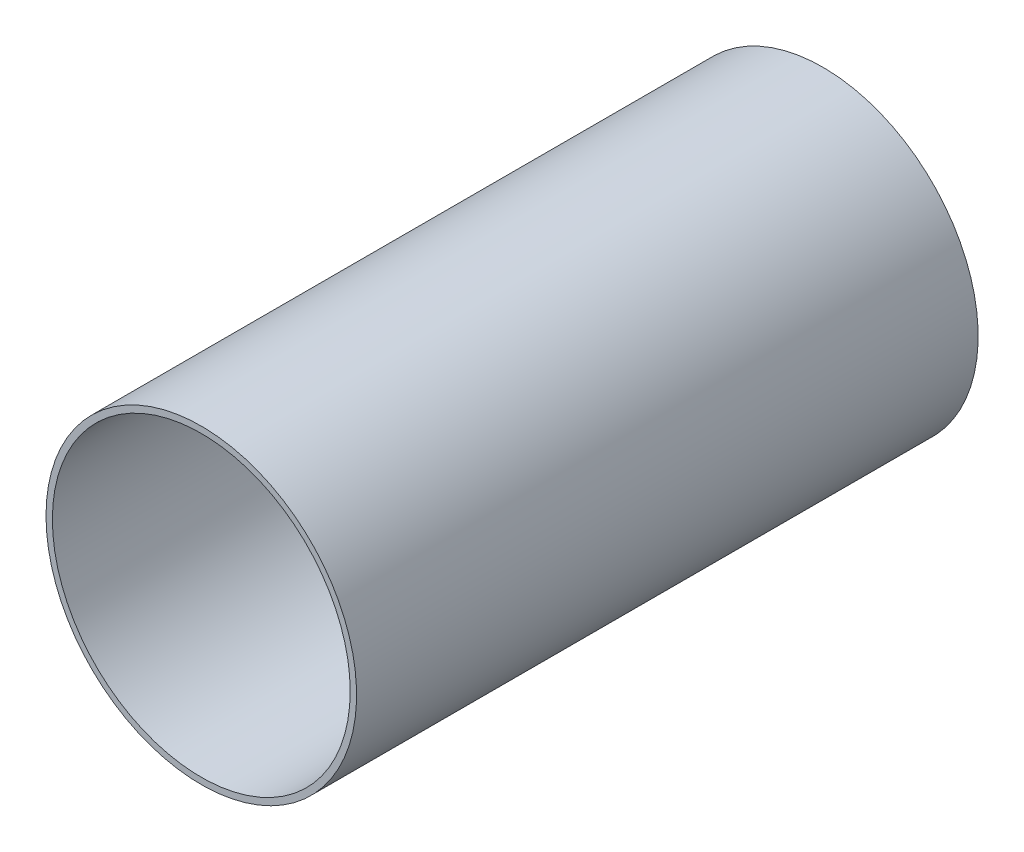
ISO-10303-21;
HEADER;
FILE_DESCRIPTION(('STEP AP214'),'2;1');
FILE_NAME('part.step','',(''),(''),'','','');
FILE_SCHEMA(('AUTOMOTIVE_DESIGN { 1 0 10303 214 1 1 1 1 }'));
ENDSEC;
DATA;
#1=APPLICATION_CONTEXT('core data for automotive mechanical design processes');
#2=APPLICATION_PROTOCOL_DEFINITION('international standard','automotive_design',2000,#1);
#3=PRODUCT_CONTEXT('',#1,'mechanical');
#4=PRODUCT('Part','Part','',(#3));
#5=PRODUCT_RELATED_PRODUCT_CATEGORY('part','',(#4));
#6=PRODUCT_DEFINITION_FORMATION('','',#4);
#7=PRODUCT_DEFINITION_CONTEXT('part definition',#1,'design');
#8=PRODUCT_DEFINITION('design','',#6,#7);
#9=PRODUCT_DEFINITION_SHAPE('','',#8);
#10=(LENGTH_UNIT() NAMED_UNIT(*) SI_UNIT(.MILLI.,.METRE.));
#11=(NAMED_UNIT(*) PLANE_ANGLE_UNIT() SI_UNIT($,.RADIAN.));
#12=(NAMED_UNIT(*) SI_UNIT($,.STERADIAN.) SOLID_ANGLE_UNIT());
#13=UNCERTAINTY_MEASURE_WITH_UNIT(LENGTH_MEASURE(1.E-05),#10,'distance_accuracy_value','');
#14=(GEOMETRIC_REPRESENTATION_CONTEXT(3) GLOBAL_UNCERTAINTY_ASSIGNED_CONTEXT((#13)) GLOBAL_UNIT_ASSIGNED_CONTEXT((#10,
#11,#12)) REPRESENTATION_CONTEXT('',''));
#15=CARTESIAN_POINT('',(0.,0.,0.));
#16=DIRECTION('',(0.,0.,1.));
#17=DIRECTION('',(1.,0.,0.));
#18=AXIS2_PLACEMENT_3D('',#15,#16,#17);
#19=CARTESIAN_POINT('',(0.,0.,152.4));
#20=DIRECTION('',(0.,0.,1.));
#21=DIRECTION('',(1.,0.,0.));
#22=AXIS2_PLACEMENT_3D('',#19,#20,#21);
#23=PLANE('',#22);
#24=CARTESIAN_POINT('',(0.,0.,152.4));
#25=DIRECTION('',(0.,0.,1.));
#26=DIRECTION('',(1.,0.,0.));
#27=AXIS2_PLACEMENT_3D('',#24,#25,#26);
#28=CIRCLE('',#27,38.0746);
#29=CARTESIAN_POINT('',(-38.0746,0.,152.4));
#30=VERTEX_POINT('',#29);
#31=EDGE_CURVE('E10',#30,#30,#28,.T.);
#32=ORIENTED_EDGE('',*,*,#31,.T.);
#33=EDGE_LOOP('',(#32));
#34=FACE_BOUND('',#33,.T.);
#35=CARTESIAN_POINT('',(0.,0.,152.4));
#36=DIRECTION('',(0.,0.,1.));
#37=DIRECTION('',(1.,0.,0.));
#38=AXIS2_PLACEMENT_3D('',#35,#36,#37);
#39=CIRCLE('',#38,36.5125);
#40=CARTESIAN_POINT('',(-36.5125,0.,152.4));
#41=VERTEX_POINT('',#40);
#42=EDGE_CURVE('E44',#41,#41,#39,.T.);
#43=ORIENTED_EDGE('',*,*,#42,.F.);
#44=EDGE_LOOP('',(#43));
#45=FACE_BOUND('',#44,.T.);
#46=ADVANCED_FACE('F33',(#34,#45),#23,.T.);
#47=CARTESIAN_POINT('',(0.,0.,0.));
#48=DIRECTION('',(0.,0.,1.));
#49=DIRECTION('',(1.,0.,0.));
#50=AXIS2_PLACEMENT_3D('',#47,#48,#49);
#51=PLANE('',#50);
#52=CARTESIAN_POINT('',(0.,0.,0.));
#53=DIRECTION('',(0.,0.,1.));
#54=DIRECTION('',(1.,0.,0.));
#55=AXIS2_PLACEMENT_3D('',#52,#53,#54);
#56=CIRCLE('',#55,38.0746);
#57=CARTESIAN_POINT('',(-38.0746,0.,0.));
#58=VERTEX_POINT('',#57);
#59=EDGE_CURVE('E37',#58,#58,#56,.T.);
#60=ORIENTED_EDGE('',*,*,#59,.F.);
#61=EDGE_LOOP('',(#60));
#62=FACE_BOUND('',#61,.T.);
#63=CARTESIAN_POINT('',(0.,0.,0.));
#64=DIRECTION('',(0.,0.,1.));
#65=DIRECTION('',(1.,0.,0.));
#66=AXIS2_PLACEMENT_3D('',#63,#64,#65);
#67=CIRCLE('',#66,36.5125);
#68=CARTESIAN_POINT('',(-36.5125,0.,0.));
#69=VERTEX_POINT('',#68);
#70=EDGE_CURVE('E46',#69,#69,#67,.T.);
#71=ORIENTED_EDGE('',*,*,#70,.T.);
#72=EDGE_LOOP('',(#71));
#73=FACE_BOUND('',#72,.T.);
#74=ADVANCED_FACE('F56',(#62,#73),#51,.F.);
#75=CARTESIAN_POINT('',(0.,0.,152.4));
#76=DIRECTION('',(0.,0.,-1.));
#77=DIRECTION('',(-1.,0.,0.));
#78=AXIS2_PLACEMENT_3D('',#75,#76,#77);
#79=CYLINDRICAL_SURFACE('',#78,38.0746);
#80=CARTESIAN_POINT('',(-38.0746,0.,152.4));
#81=CARTESIAN_POINT('',(-38.0746,0.,150.8125));
#82=CARTESIAN_POINT('',(-38.0746,0.,149.225));
#83=CARTESIAN_POINT('',(-38.0746,0.,146.05));
#84=CARTESIAN_POINT('',(-38.0746,0.,144.4625));
#85=CARTESIAN_POINT('',(-38.0746,0.,141.2875));
#86=CARTESIAN_POINT('',(-38.0746,0.,139.7));
#87=CARTESIAN_POINT('',(-38.0746,0.,136.525));
#88=CARTESIAN_POINT('',(-38.0746,0.,134.9375));
#89=CARTESIAN_POINT('',(-38.0746,0.,131.7625));
#90=CARTESIAN_POINT('',(-38.0746,0.,130.175));
#91=CARTESIAN_POINT('',(-38.0746,0.,127.));
#92=CARTESIAN_POINT('',(-38.0746,0.,125.4125));
#93=CARTESIAN_POINT('',(-38.0746,0.,122.2375));
#94=CARTESIAN_POINT('',(-38.0746,0.,120.65));
#95=CARTESIAN_POINT('',(-38.0746,0.,117.475));
#96=CARTESIAN_POINT('',(-38.0746,0.,115.8875));
#97=CARTESIAN_POINT('',(-38.0746,0.,112.7125));
#98=CARTESIAN_POINT('',(-38.0746,0.,111.125));
#99=CARTESIAN_POINT('',(-38.0746,0.,107.95));
#100=CARTESIAN_POINT('',(-38.0746,0.,106.3625));
#101=CARTESIAN_POINT('',(-38.0746,0.,103.1875));
#102=CARTESIAN_POINT('',(-38.0746,0.,101.6));
#103=CARTESIAN_POINT('',(-38.0746,0.,98.425));
#104=CARTESIAN_POINT('',(-38.0746,0.,96.8375));
#105=CARTESIAN_POINT('',(-38.0746,0.,93.6625));
#106=CARTESIAN_POINT('',(-38.0746,0.,92.075));
#107=CARTESIAN_POINT('',(-38.0746,0.,88.9));
#108=CARTESIAN_POINT('',(-38.0746,0.,87.3125));
#109=CARTESIAN_POINT('',(-38.0746,0.,84.1375));
#110=CARTESIAN_POINT('',(-38.0746,0.,82.55));
#111=CARTESIAN_POINT('',(-38.0746,0.,79.375));
#112=CARTESIAN_POINT('',(-38.0746,0.,77.7875));
#113=CARTESIAN_POINT('',(-38.0746,0.,74.6125));
#114=CARTESIAN_POINT('',(-38.0746,0.,73.025));
#115=CARTESIAN_POINT('',(-38.0746,0.,69.85));
#116=CARTESIAN_POINT('',(-38.0746,0.,68.2625));
#117=CARTESIAN_POINT('',(-38.0746,0.,65.0875));
#118=CARTESIAN_POINT('',(-38.0746,0.,63.5));
#119=CARTESIAN_POINT('',(-38.0746,0.,60.325));
#120=CARTESIAN_POINT('',(-38.0746,0.,58.7375));
#121=CARTESIAN_POINT('',(-38.0746,0.,55.5625));
#122=CARTESIAN_POINT('',(-38.0746,0.,53.975));
#123=CARTESIAN_POINT('',(-38.0746,0.,50.8));
#124=CARTESIAN_POINT('',(-38.0746,0.,49.2125));
#125=CARTESIAN_POINT('',(-38.0746,0.,46.0375));
#126=CARTESIAN_POINT('',(-38.0746,0.,44.45));
#127=CARTESIAN_POINT('',(-38.0746,0.,41.275));
#128=CARTESIAN_POINT('',(-38.0746,0.,39.6875));
#129=CARTESIAN_POINT('',(-38.0746,0.,36.5125));
#130=CARTESIAN_POINT('',(-38.0746,0.,34.925));
#131=CARTESIAN_POINT('',(-38.0746,0.,31.75));
#132=CARTESIAN_POINT('',(-38.0746,0.,30.1625));
#133=CARTESIAN_POINT('',(-38.0746,0.,26.9875));
#134=CARTESIAN_POINT('',(-38.0746,0.,25.4));
#135=CARTESIAN_POINT('',(-38.0746,0.,22.225));
#136=CARTESIAN_POINT('',(-38.0746,0.,20.6375));
#137=CARTESIAN_POINT('',(-38.0746,0.,17.4625));
#138=CARTESIAN_POINT('',(-38.0746,0.,15.875));
#139=CARTESIAN_POINT('',(-38.0746,0.,12.7));
#140=CARTESIAN_POINT('',(-38.0746,0.,11.1125));
#141=CARTESIAN_POINT('',(-38.0746,0.,7.93750000000001));
#142=CARTESIAN_POINT('',(-38.0746,0.,6.35));
#143=CARTESIAN_POINT('',(-38.0746,0.,3.175));
#144=CARTESIAN_POINT('',(-38.0746,0.,1.5875));
#145=CARTESIAN_POINT('',(-38.0746,0.,0.));
#146=B_SPLINE_CURVE_WITH_KNOTS('',3,(#80,#81,#82,#83,#84,#85,#86,#87,#88,#89,#90,#91,#92,#93,
#94,#95,#96,#97,#98,#99,#100,#101,#102,#103,#104,#105,#106,#107,#108,#109,#110,#111,#112,#113,
#114,#115,#116,#117,#118,#119,#120,#121,#122,#123,#124,#125,#126,#127,#128,#129,#130,#131,#132,
#133,#134,#135,#136,#137,#138,#139,#140,#141,#142,#143,#144,#145),.UNSPECIFIED.,.F.,.F.,(4,2,2,
2,2,2,2,2,2,2,2,2,2,2,2,2,2,2,2,2,2,2,2,2,2,2,2,2,2,2,2,2,4),(0.,4.7625,9.52500000000001,
14.2875,19.05,23.8125,28.575,33.3375,38.1,42.8625,47.625,52.3875,57.15,61.9125,66.675,71.4375,
76.2,80.9625,85.725,90.4875,95.25,100.0125,104.775,109.5375,114.3,119.0625,123.825,128.5875,
133.35,138.1125,142.875,147.6375,152.4),.UNSPECIFIED.);
#147=EDGE_CURVE('BSEAM35',#30,#58,#146,.T.);
#148=ORIENTED_EDGE('',*,*,#31,.F.);
#149=ORIENTED_EDGE('',*,*,#59,.T.);
#150=ORIENTED_EDGE('',*,*,#147,.T.);
#151=ORIENTED_EDGE('',*,*,#147,.F.);
#152=EDGE_LOOP('',(#148,#150,#149,#151));
#153=FACE_BOUND('',#152,.T.);
#154=ADVANCED_FACE('F35',(#153),#79,.T.);
#155=CARTESIAN_POINT('',(0.,0.,152.4));
#156=DIRECTION('',(0.,0.,-1.));
#157=DIRECTION('',(-1.,0.,0.));
#158=AXIS2_PLACEMENT_3D('',#155,#156,#157);
#159=CYLINDRICAL_SURFACE('',#158,36.5125);
#160=CARTESIAN_POINT('',(-36.5125,0.,152.4));
#161=CARTESIAN_POINT('',(-36.5125,0.,150.8125));
#162=CARTESIAN_POINT('',(-36.5125,0.,149.225));
#163=CARTESIAN_POINT('',(-36.5125,0.,146.05));
#164=CARTESIAN_POINT('',(-36.5125,0.,144.4625));
#165=CARTESIAN_POINT('',(-36.5125,0.,141.2875));
#166=CARTESIAN_POINT('',(-36.5125,0.,139.7));
#167=CARTESIAN_POINT('',(-36.5125,0.,136.525));
#168=CARTESIAN_POINT('',(-36.5125,0.,134.9375));
#169=CARTESIAN_POINT('',(-36.5125,0.,131.7625));
#170=CARTESIAN_POINT('',(-36.5125,0.,130.175));
#171=CARTESIAN_POINT('',(-36.5125,0.,127.));
#172=CARTESIAN_POINT('',(-36.5125,0.,125.4125));
#173=CARTESIAN_POINT('',(-36.5125,0.,122.2375));
#174=CARTESIAN_POINT('',(-36.5125,0.,120.65));
#175=CARTESIAN_POINT('',(-36.5125,0.,117.475));
#176=CARTESIAN_POINT('',(-36.5125,0.,115.8875));
#177=CARTESIAN_POINT('',(-36.5125,0.,112.7125));
#178=CARTESIAN_POINT('',(-36.5125,0.,111.125));
#179=CARTESIAN_POINT('',(-36.5125,0.,107.95));
#180=CARTESIAN_POINT('',(-36.5125,0.,106.3625));
#181=CARTESIAN_POINT('',(-36.5125,0.,103.1875));
#182=CARTESIAN_POINT('',(-36.5125,0.,101.6));
#183=CARTESIAN_POINT('',(-36.5125,0.,98.425));
#184=CARTESIAN_POINT('',(-36.5125,0.,96.8375));
#185=CARTESIAN_POINT('',(-36.5125,0.,93.6625));
#186=CARTESIAN_POINT('',(-36.5125,0.,92.075));
#187=CARTESIAN_POINT('',(-36.5125,0.,88.9));
#188=CARTESIAN_POINT('',(-36.5125,0.,87.3125));
#189=CARTESIAN_POINT('',(-36.5125,0.,84.1375));
#190=CARTESIAN_POINT('',(-36.5125,0.,82.55));
#191=CARTESIAN_POINT('',(-36.5125,0.,79.375));
#192=CARTESIAN_POINT('',(-36.5125,0.,77.7875));
#193=CARTESIAN_POINT('',(-36.5125,0.,74.6125));
#194=CARTESIAN_POINT('',(-36.5125,0.,73.025));
#195=CARTESIAN_POINT('',(-36.5125,0.,69.85));
#196=CARTESIAN_POINT('',(-36.5125,0.,68.2625));
#197=CARTESIAN_POINT('',(-36.5125,0.,65.0875));
#198=CARTESIAN_POINT('',(-36.5125,0.,63.5));
#199=CARTESIAN_POINT('',(-36.5125,0.,60.325));
#200=CARTESIAN_POINT('',(-36.5125,0.,58.7375));
#201=CARTESIAN_POINT('',(-36.5125,0.,55.5625));
#202=CARTESIAN_POINT('',(-36.5125,0.,53.975));
#203=CARTESIAN_POINT('',(-36.5125,0.,50.8));
#204=CARTESIAN_POINT('',(-36.5125,0.,49.2125));
#205=CARTESIAN_POINT('',(-36.5125,0.,46.0375));
#206=CARTESIAN_POINT('',(-36.5125,0.,44.45));
#207=CARTESIAN_POINT('',(-36.5125,0.,41.275));
#208=CARTESIAN_POINT('',(-36.5125,0.,39.6875));
#209=CARTESIAN_POINT('',(-36.5125,0.,36.5125));
#210=CARTESIAN_POINT('',(-36.5125,0.,34.925));
#211=CARTESIAN_POINT('',(-36.5125,0.,31.75));
#212=CARTESIAN_POINT('',(-36.5125,0.,30.1625));
#213=CARTESIAN_POINT('',(-36.5125,0.,26.9875));
#214=CARTESIAN_POINT('',(-36.5125,0.,25.4));
#215=CARTESIAN_POINT('',(-36.5125,0.,22.225));
#216=CARTESIAN_POINT('',(-36.5125,0.,20.6375));
#217=CARTESIAN_POINT('',(-36.5125,0.,17.4625));
#218=CARTESIAN_POINT('',(-36.5125,0.,15.875));
#219=CARTESIAN_POINT('',(-36.5125,0.,12.7));
#220=CARTESIAN_POINT('',(-36.5125,0.,11.1125));
#221=CARTESIAN_POINT('',(-36.5125,0.,7.93750000000001));
#222=CARTESIAN_POINT('',(-36.5125,0.,6.35));
#223=CARTESIAN_POINT('',(-36.5125,0.,3.175));
#224=CARTESIAN_POINT('',(-36.5125,0.,1.5875));
#225=CARTESIAN_POINT('',(-36.5125,0.,0.));
#226=B_SPLINE_CURVE_WITH_KNOTS('',3,(#160,#161,#162,#163,#164,#165,#166,#167,#168,#169,#170,
#171,#172,#173,#174,#175,#176,#177,#178,#179,#180,#181,#182,#183,#184,#185,#186,#187,#188,#189,
#190,#191,#192,#193,#194,#195,#196,#197,#198,#199,#200,#201,#202,#203,#204,#205,#206,#207,#208,
#209,#210,#211,#212,#213,#214,#215,#216,#217,#218,#219,#220,#221,#222,#223,#224,#225),
.UNSPECIFIED.,.F.,.F.,(4,2,2,2,2,2,2,2,2,2,2,2,2,2,2,2,2,2,2,2,2,2,2,2,2,2,2,2,2,2,2,2,4),(0.,
4.76249999999998,9.52499999999998,14.2875,19.05,23.8125,28.575,33.3375,38.1,42.8625,47.625,
52.3875,57.15,61.9125,66.675,71.4375,76.2,80.9625,85.725,90.4875,95.25,100.0125,104.775,
109.5375,114.3,119.0625,123.825,128.5875,133.35,138.1125,142.875,147.6375,152.4),.UNSPECIFIED.);
#227=EDGE_CURVE('BSEAM52',#41,#69,#226,.T.);
#228=ORIENTED_EDGE('',*,*,#42,.T.);
#229=ORIENTED_EDGE('',*,*,#70,.F.);
#230=ORIENTED_EDGE('',*,*,#227,.T.);
#231=ORIENTED_EDGE('',*,*,#227,.F.);
#232=EDGE_LOOP('',(#228,#230,#229,#231));
#233=FACE_BOUND('',#232,.T.);
#234=ADVANCED_FACE('F52',(#233),#159,.F.);
#235=CLOSED_SHELL('',(#46,#74,#154,#234));
#236=MANIFOLD_SOLID_BREP('B2',#235);
#237=ADVANCED_BREP_SHAPE_REPRESENTATION('',(#18,#236),#14);
#238=SHAPE_DEFINITION_REPRESENTATION(#9,#237);
ENDSEC;
END-ISO-10303-21;
